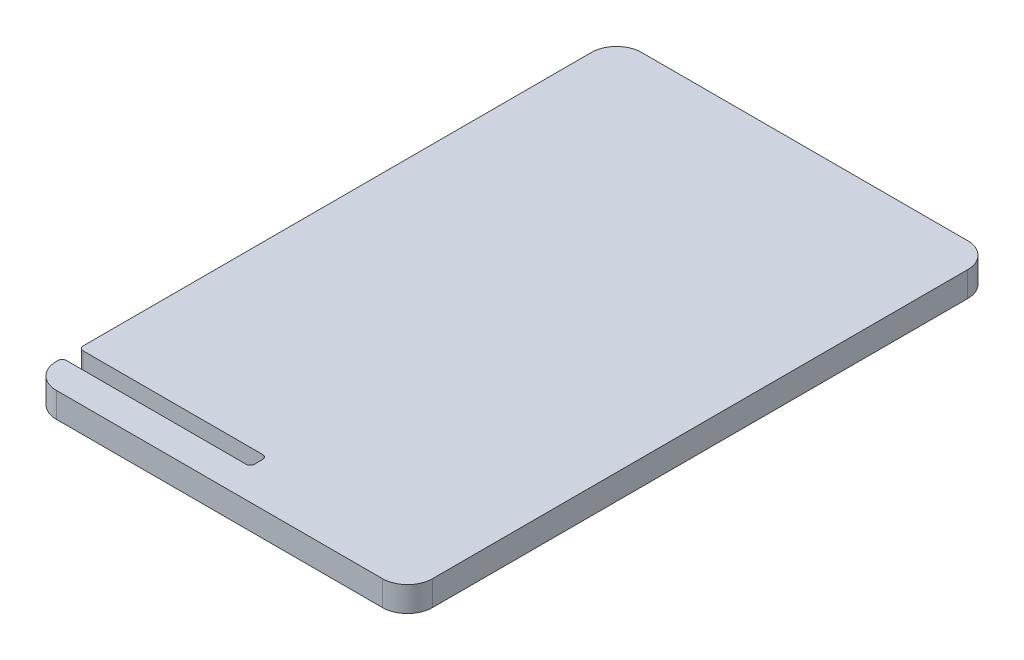
ISO-10303-21;
HEADER;
FILE_DESCRIPTION(('STEP AP214'),'2;1');
FILE_NAME('part.step','',(''),(''),'','','');
FILE_SCHEMA(('AUTOMOTIVE_DESIGN { 1 0 10303 214 1 1 1 1 }'));
ENDSEC;
DATA;
#1=APPLICATION_CONTEXT('core data for automotive mechanical design processes');
#2=APPLICATION_PROTOCOL_DEFINITION('international standard','automotive_design',2000,#1);
#3=PRODUCT_CONTEXT('',#1,'mechanical');
#4=PRODUCT('Part','Part','',(#3));
#5=PRODUCT_RELATED_PRODUCT_CATEGORY('part','',(#4));
#6=PRODUCT_DEFINITION_FORMATION('','',#4);
#7=PRODUCT_DEFINITION_CONTEXT('part definition',#1,'design');
#8=PRODUCT_DEFINITION('design','',#6,#7);
#9=PRODUCT_DEFINITION_SHAPE('','',#8);
#10=(LENGTH_UNIT() NAMED_UNIT(*) SI_UNIT(.MILLI.,.METRE.));
#11=(NAMED_UNIT(*) PLANE_ANGLE_UNIT() SI_UNIT($,.RADIAN.));
#12=(NAMED_UNIT(*) SI_UNIT($,.STERADIAN.) SOLID_ANGLE_UNIT());
#13=UNCERTAINTY_MEASURE_WITH_UNIT(LENGTH_MEASURE(1.E-05),#10,'distance_accuracy_value','');
#14=(GEOMETRIC_REPRESENTATION_CONTEXT(3) GLOBAL_UNCERTAINTY_ASSIGNED_CONTEXT((#13)) GLOBAL_UNIT_ASSIGNED_CONTEXT((#10,
#11,#12)) REPRESENTATION_CONTEXT('',''));
#15=CARTESIAN_POINT('',(0.,0.,0.));
#16=DIRECTION('',(0.,0.,1.));
#17=DIRECTION('',(1.,0.,0.));
#18=AXIS2_PLACEMENT_3D('',#15,#16,#17);
#19=CARTESIAN_POINT('',(-22.5,3.,-35.3062315740794));
#20=DIRECTION('',(1.,0.,0.));
#21=DIRECTION('',(0.,0.,-1.));
#22=AXIS2_PLACEMENT_3D('',#19,#20,#21);
#23=PLANE('',#22);
#24=DIRECTION('',(0.,0.,1.));
#25=VECTOR('',#24,1.);
#26=CARTESIAN_POINT('',(-22.5,0.,-35.3062315740794));
#27=LINE('',#26,#25);
#28=CARTESIAN_POINT('',(-22.5,0.,-32.3062315740794));
#29=VERTEX_POINT('',#28);
#30=CARTESIAN_POINT('',(-22.5,0.,28.5));
#31=VERTEX_POINT('',#30);
#32=EDGE_CURVE('E186',#29,#31,#27,.T.);
#33=ORIENTED_EDGE('',*,*,#32,.T.);
#34=DIRECTION('',(0.,1.,0.));
#35=VECTOR('',#34,1.);
#36=CARTESIAN_POINT('',(-22.5,3.,28.5));
#37=LINE('',#36,#35);
#38=CARTESIAN_POINT('',(-22.5,3.,28.5));
#39=VERTEX_POINT('',#38);
#40=EDGE_CURVE('E278',#31,#39,#37,.T.);
#41=ORIENTED_EDGE('',*,*,#40,.T.);
#42=DIRECTION('',(0.,0.,1.));
#43=VECTOR('',#42,1.);
#44=CARTESIAN_POINT('',(-22.5,3.,-35.3062315740794));
#45=LINE('',#44,#43);
#46=CARTESIAN_POINT('',(-22.5,3.,-32.3062315740794));
#47=VERTEX_POINT('',#46);
#48=EDGE_CURVE('E327',#47,#39,#45,.T.);
#49=ORIENTED_EDGE('',*,*,#48,.F.);
#50=DIRECTION('',(0.,-1.,0.));
#51=VECTOR('',#50,1.);
#52=CARTESIAN_POINT('',(-22.5,3.,-32.3062315740794));
#53=LINE('',#52,#51);
#54=EDGE_CURVE('E232',#47,#29,#53,.T.);
#55=ORIENTED_EDGE('',*,*,#54,.T.);
#56=EDGE_LOOP('',(#33,#41,#49,#55));
#57=FACE_BOUND('',#56,.T.);
#58=ADVANCED_FACE('F43',(#57),#23,.F.);
#59=CARTESIAN_POINT('',(-22.5,3.,31.5));
#60=VERTEX_POINT('',#59);
#61=CARTESIAN_POINT('',(-22.5,3.,31.6937684259206));
#62=VERTEX_POINT('',#61);
#63=EDGE_CURVE('E200',#60,#62,#45,.T.);
#64=ORIENTED_EDGE('',*,*,#63,.F.);
#65=DIRECTION('',(0.,1.,0.));
#66=VECTOR('',#65,1.);
#67=CARTESIAN_POINT('',(-22.5,3.,31.5));
#68=LINE('',#67,#66);
#69=CARTESIAN_POINT('',(-22.5,0.,31.5));
#70=VERTEX_POINT('',#69);
#71=EDGE_CURVE('E256',#60,#70,#68,.F.);
#72=ORIENTED_EDGE('',*,*,#71,.T.);
#73=CARTESIAN_POINT('',(-22.5,0.,31.6937684259206));
#74=VERTEX_POINT('',#73);
#75=EDGE_CURVE('E193',#70,#74,#27,.T.);
#76=ORIENTED_EDGE('',*,*,#75,.T.);
#77=DIRECTION('',(0.,-1.,0.));
#78=VECTOR('',#77,1.);
#79=CARTESIAN_POINT('',(-22.5,3.,31.6937684259206));
#80=LINE('',#79,#78);
#81=EDGE_CURVE('E164',#74,#62,#80,.F.);
#82=ORIENTED_EDGE('',*,*,#81,.T.);
#83=EDGE_LOOP('',(#64,#72,#76,#82));
#84=FACE_BOUND('',#83,.T.);
#85=ADVANCED_FACE('F366',(#84),#23,.F.);
#86=CARTESIAN_POINT('',(-22.5,3.,34.6937684259206));
#87=DIRECTION('',(0.,0.,-1.));
#88=DIRECTION('',(-1.,0.,0.));
#89=AXIS2_PLACEMENT_3D('',#86,#87,#88);
#90=PLANE('',#89);
#91=DIRECTION('',(1.,0.,0.));
#92=VECTOR('',#91,1.);
#93=CARTESIAN_POINT('',(-22.5,3.,34.6937684259206));
#94=LINE('',#93,#92);
#95=CARTESIAN_POINT('',(-19.5,3.,34.6937684259206));
#96=VERTEX_POINT('',#95);
#97=CARTESIAN_POINT('',(19.5,3.,34.6937684259206));
#98=VERTEX_POINT('',#97);
#99=EDGE_CURVE('E177',#96,#98,#94,.T.);
#100=ORIENTED_EDGE('',*,*,#99,.F.);
#101=DIRECTION('',(0.,-1.,0.));
#102=VECTOR('',#101,1.);
#103=CARTESIAN_POINT('',(-19.5,3.,34.6937684259206));
#104=LINE('',#103,#102);
#105=CARTESIAN_POINT('',(-19.5,0.,34.6937684259206));
#106=VERTEX_POINT('',#105);
#107=EDGE_CURVE('E162',#96,#106,#104,.T.);
#108=ORIENTED_EDGE('',*,*,#107,.T.);
#109=DIRECTION('',(1.,0.,0.));
#110=VECTOR('',#109,1.);
#111=CARTESIAN_POINT('',(-22.5,0.,34.6937684259206));
#112=LINE('',#111,#110);
#113=CARTESIAN_POINT('',(19.5,0.,34.6937684259206));
#114=VERTEX_POINT('',#113);
#115=EDGE_CURVE('E174',#106,#114,#112,.T.);
#116=ORIENTED_EDGE('',*,*,#115,.T.);
#117=DIRECTION('',(0.,-1.,0.));
#118=VECTOR('',#117,1.);
#119=CARTESIAN_POINT('',(19.5,3.,34.6937684259206));
#120=LINE('',#119,#118);
#121=EDGE_CURVE('E180',#114,#98,#120,.F.);
#122=ORIENTED_EDGE('',*,*,#121,.T.);
#123=EDGE_LOOP('',(#100,#108,#116,#122));
#124=FACE_BOUND('',#123,.T.);
#125=ADVANCED_FACE('F173',(#124),#90,.F.);
#126=CARTESIAN_POINT('',(22.5,3.,-35.3062315740794));
#127=DIRECTION('',(-1.,0.,0.));
#128=DIRECTION('',(0.,0.,1.));
#129=AXIS2_PLACEMENT_3D('',#126,#127,#128);
#130=PLANE('',#129);
#131=DIRECTION('',(0.,0.,-1.));
#132=VECTOR('',#131,1.);
#133=CARTESIAN_POINT('',(22.5,3.,-35.3062315740794));
#134=LINE('',#133,#132);
#135=CARTESIAN_POINT('',(22.5,3.,31.6937684259206));
#136=VERTEX_POINT('',#135);
#137=CARTESIAN_POINT('',(22.5,3.,-32.3062315740794));
#138=VERTEX_POINT('',#137);
#139=EDGE_CURVE('E333',#136,#138,#134,.T.);
#140=ORIENTED_EDGE('',*,*,#139,.F.);
#141=DIRECTION('',(0.,-1.,0.));
#142=VECTOR('',#141,1.);
#143=CARTESIAN_POINT('',(22.5,3.,31.6937684259206));
#144=LINE('',#143,#142);
#145=CARTESIAN_POINT('',(22.5,0.,31.6937684259206));
#146=VERTEX_POINT('',#145);
#147=EDGE_CURVE('E228',#136,#146,#144,.T.);
#148=ORIENTED_EDGE('',*,*,#147,.T.);
#149=DIRECTION('',(0.,0.,-1.));
#150=VECTOR('',#149,1.);
#151=CARTESIAN_POINT('',(22.5,0.,-35.3062315740794));
#152=LINE('',#151,#150);
#153=CARTESIAN_POINT('',(22.5,0.,-32.3062315740794));
#154=VERTEX_POINT('',#153);
#155=EDGE_CURVE('E185',#146,#154,#152,.T.);
#156=ORIENTED_EDGE('',*,*,#155,.T.);
#157=DIRECTION('',(0.,-1.,0.));
#158=VECTOR('',#157,1.);
#159=CARTESIAN_POINT('',(22.5,3.,-32.3062315740794));
#160=LINE('',#159,#158);
#161=EDGE_CURVE('E225',#154,#138,#160,.F.);
#162=ORIENTED_EDGE('',*,*,#161,.T.);
#163=EDGE_LOOP('',(#140,#148,#156,#162));
#164=FACE_BOUND('',#163,.T.);
#165=ADVANCED_FACE('F357',(#164),#130,.F.);
#166=CARTESIAN_POINT('',(-22.5,3.,-35.3062315740794));
#167=DIRECTION('',(0.,0.,1.));
#168=DIRECTION('',(1.,0.,0.));
#169=AXIS2_PLACEMENT_3D('',#166,#167,#168);
#170=PLANE('',#169);
#171=DIRECTION('',(-1.,0.,0.));
#172=VECTOR('',#171,1.);
#173=CARTESIAN_POINT('',(-22.5,0.,-35.3062315740794));
#174=LINE('',#173,#172);
#175=CARTESIAN_POINT('',(19.5,0.,-35.3062315740794));
#176=VERTEX_POINT('',#175);
#177=CARTESIAN_POINT('',(-19.5,0.,-35.3062315740794));
#178=VERTEX_POINT('',#177);
#179=EDGE_CURVE('E191',#176,#178,#174,.T.);
#180=ORIENTED_EDGE('',*,*,#179,.T.);
#181=DIRECTION('',(0.,-1.,0.));
#182=VECTOR('',#181,1.);
#183=CARTESIAN_POINT('',(-19.5,3.,-35.3062315740794));
#184=LINE('',#183,#182);
#185=CARTESIAN_POINT('',(-19.5,3.,-35.3062315740794));
#186=VERTEX_POINT('',#185);
#187=EDGE_CURVE('E240',#178,#186,#184,.F.);
#188=ORIENTED_EDGE('',*,*,#187,.T.);
#189=DIRECTION('',(-1.,0.,0.));
#190=VECTOR('',#189,1.);
#191=CARTESIAN_POINT('',(-22.5,3.,-35.3062315740794));
#192=LINE('',#191,#190);
#193=CARTESIAN_POINT('',(19.5,3.,-35.3062315740794));
#194=VERTEX_POINT('',#193);
#195=EDGE_CURVE('E202',#194,#186,#192,.T.);
#196=ORIENTED_EDGE('',*,*,#195,.F.);
#197=DIRECTION('',(0.,-1.,0.));
#198=VECTOR('',#197,1.);
#199=CARTESIAN_POINT('',(19.5,3.,-35.3062315740794));
#200=LINE('',#199,#198);
#201=EDGE_CURVE('E236',#194,#176,#200,.T.);
#202=ORIENTED_EDGE('',*,*,#201,.T.);
#203=EDGE_LOOP('',(#180,#188,#196,#202));
#204=FACE_BOUND('',#203,.T.);
#205=ADVANCED_FACE('F351',(#204),#170,.F.);
#206=CARTESIAN_POINT('',(0.,3.,0.));
#207=DIRECTION('',(0.,1.,0.));
#208=DIRECTION('',(0.,0.,1.));
#209=AXIS2_PLACEMENT_3D('',#206,#207,#208);
#210=PLANE('',#209);
#211=DIRECTION('',(1.,0.,0.));
#212=VECTOR('',#211,1.);
#213=CARTESIAN_POINT('',(-22.5,3.,31.));
#214=LINE('',#213,#212);
#215=CARTESIAN_POINT('',(-22.,3.,31.));
#216=VERTEX_POINT('',#215);
#217=CARTESIAN_POINT('',(-0.500000000000007,3.,31.));
#218=VERTEX_POINT('',#217);
#219=EDGE_CURVE('E305',#216,#218,#214,.T.);
#220=ORIENTED_EDGE('',*,*,#219,.F.);
#221=CARTESIAN_POINT('',(-22.,3.,31.5));
#222=DIRECTION('',(0.,1.,0.));
#223=DIRECTION('',(0.,0.,1.));
#224=AXIS2_PLACEMENT_3D('',#221,#222,#223);
#225=CIRCLE('',#224,0.5);
#226=EDGE_CURVE('E253',#216,#60,#225,.T.);
#227=ORIENTED_EDGE('',*,*,#226,.T.);
#228=ORIENTED_EDGE('',*,*,#63,.T.);
#229=CARTESIAN_POINT('',(-19.5,3.,31.6937684259206));
#230=DIRECTION('',(0.,1.,0.));
#231=DIRECTION('',(0.,0.,1.));
#232=AXIS2_PLACEMENT_3D('',#229,#230,#231);
#233=CIRCLE('',#232,3.);
#234=EDGE_CURVE('E222',#62,#96,#233,.T.);
#235=ORIENTED_EDGE('',*,*,#234,.T.);
#236=ORIENTED_EDGE('',*,*,#99,.T.);
#237=CARTESIAN_POINT('',(19.5,3.,31.6937684259206));
#238=DIRECTION('',(0.,1.,0.));
#239=DIRECTION('',(0.,0.,1.));
#240=AXIS2_PLACEMENT_3D('',#237,#238,#239);
#241=CIRCLE('',#240,3.);
#242=EDGE_CURVE('E219',#98,#136,#241,.T.);
#243=ORIENTED_EDGE('',*,*,#242,.T.);
#244=ORIENTED_EDGE('',*,*,#139,.T.);
#245=CARTESIAN_POINT('',(19.5,3.,-32.3062315740794));
#246=DIRECTION('',(0.,1.,0.));
#247=DIRECTION('',(0.,0.,1.));
#248=AXIS2_PLACEMENT_3D('',#245,#246,#247);
#249=CIRCLE('',#248,3.);
#250=EDGE_CURVE('E213',#138,#194,#249,.T.);
#251=ORIENTED_EDGE('',*,*,#250,.T.);
#252=ORIENTED_EDGE('',*,*,#195,.T.);
#253=CARTESIAN_POINT('',(-19.5,3.,-32.3062315740794));
#254=DIRECTION('',(0.,1.,0.));
#255=DIRECTION('',(0.,0.,1.));
#256=AXIS2_PLACEMENT_3D('',#253,#254,#255);
#257=CIRCLE('',#256,3.);
#258=EDGE_CURVE('E216',#186,#47,#257,.T.);
#259=ORIENTED_EDGE('',*,*,#258,.T.);
#260=ORIENTED_EDGE('',*,*,#48,.T.);
#261=CARTESIAN_POINT('',(-22.,3.,28.5));
#262=DIRECTION('',(0.,1.,0.));
#263=DIRECTION('',(0.,0.,1.));
#264=AXIS2_PLACEMENT_3D('',#261,#262,#263);
#265=CIRCLE('',#264,0.5);
#266=CARTESIAN_POINT('',(-22.,3.,29.));
#267=VERTEX_POINT('',#266);
#268=EDGE_CURVE('E250',#39,#267,#265,.T.);
#269=ORIENTED_EDGE('',*,*,#268,.T.);
#270=DIRECTION('',(-1.,0.,0.));
#271=VECTOR('',#270,1.);
#272=CARTESIAN_POINT('',(-22.5,3.,29.));
#273=LINE('',#272,#271);
#274=CARTESIAN_POINT('',(-0.500000000000007,3.,29.));
#275=VERTEX_POINT('',#274);
#276=EDGE_CURVE('E296',#275,#267,#273,.T.);
#277=ORIENTED_EDGE('',*,*,#276,.F.);
#278=CARTESIAN_POINT('',(-0.5,3.,29.5));
#279=DIRECTION('',(0.,1.,0.));
#280=DIRECTION('',(0.,0.,1.));
#281=AXIS2_PLACEMENT_3D('',#278,#279,#280);
#282=CIRCLE('',#281,0.5);
#283=CARTESIAN_POINT('',(0.,3.,29.5));
#284=VERTEX_POINT('',#283);
#285=EDGE_CURVE('E52',#275,#284,#282,.F.);
#286=ORIENTED_EDGE('',*,*,#285,.T.);
#287=DIRECTION('',(0.,0.,-1.));
#288=VECTOR('',#287,1.);
#289=CARTESIAN_POINT('',(0.,3.,29.));
#290=LINE('',#289,#288);
#291=CARTESIAN_POINT('',(0.,3.,30.5));
#292=VERTEX_POINT('',#291);
#293=EDGE_CURVE('E294',#292,#284,#290,.T.);
#294=ORIENTED_EDGE('',*,*,#293,.F.);
#295=CARTESIAN_POINT('',(-0.5,3.,30.5));
#296=DIRECTION('',(0.,1.,0.));
#297=DIRECTION('',(0.,0.,1.));
#298=AXIS2_PLACEMENT_3D('',#295,#296,#297);
#299=CIRCLE('',#298,0.5);
#300=EDGE_CURVE('E282',#292,#218,#299,.F.);
#301=ORIENTED_EDGE('',*,*,#300,.T.);
#302=EDGE_LOOP('',(#220,#227,#228,#235,#236,#243,#244,#251,#252,#259,#260,#269,#277,#286,#294,#301));
#303=FACE_BOUND('',#302,.T.);
#304=ADVANCED_FACE('F293',(#303),#210,.T.);
#305=CARTESIAN_POINT('',(0.,0.,0.));
#306=DIRECTION('',(0.,1.,0.));
#307=DIRECTION('',(0.,0.,1.));
#308=AXIS2_PLACEMENT_3D('',#305,#306,#307);
#309=PLANE('',#308);
#310=ORIENTED_EDGE('',*,*,#75,.F.);
#311=CARTESIAN_POINT('',(-22.,0.,31.5));
#312=DIRECTION('',(0.,1.,0.));
#313=DIRECTION('',(0.,0.,1.));
#314=AXIS2_PLACEMENT_3D('',#311,#312,#313);
#315=CIRCLE('',#314,0.5);
#316=CARTESIAN_POINT('',(-22.,0.,31.));
#317=VERTEX_POINT('',#316);
#318=EDGE_CURVE('E261',#70,#317,#315,.F.);
#319=ORIENTED_EDGE('',*,*,#318,.T.);
#320=DIRECTION('',(-1.,0.,0.));
#321=VECTOR('',#320,1.);
#322=CARTESIAN_POINT('',(-22.5,0.,31.));
#323=LINE('',#322,#321);
#324=CARTESIAN_POINT('',(-0.5,0.,31.));
#325=VERTEX_POINT('',#324);
#326=EDGE_CURVE('E313',#325,#317,#323,.T.);
#327=ORIENTED_EDGE('',*,*,#326,.F.);
#328=CARTESIAN_POINT('',(-0.5,0.,30.5));
#329=DIRECTION('',(0.,1.,0.));
#330=DIRECTION('',(0.,0.,1.));
#331=AXIS2_PLACEMENT_3D('',#328,#329,#330);
#332=CIRCLE('',#331,0.5);
#333=CARTESIAN_POINT('',(0.,0.,30.5));
#334=VERTEX_POINT('',#333);
#335=EDGE_CURVE('E285',#325,#334,#332,.T.);
#336=ORIENTED_EDGE('',*,*,#335,.T.);
#337=DIRECTION('',(0.,0.,1.));
#338=VECTOR('',#337,1.);
#339=CARTESIAN_POINT('',(0.,0.,29.));
#340=LINE('',#339,#338);
#341=CARTESIAN_POINT('',(0.,0.,29.5));
#342=VERTEX_POINT('',#341);
#343=EDGE_CURVE('E314',#342,#334,#340,.T.);
#344=ORIENTED_EDGE('',*,*,#343,.F.);
#345=CARTESIAN_POINT('',(-0.5,0.,29.5));
#346=DIRECTION('',(0.,1.,0.));
#347=DIRECTION('',(0.,0.,1.));
#348=AXIS2_PLACEMENT_3D('',#345,#346,#347);
#349=CIRCLE('',#348,0.5);
#350=CARTESIAN_POINT('',(-0.5,0.,29.));
#351=VERTEX_POINT('',#350);
#352=EDGE_CURVE('E11',#342,#351,#349,.T.);
#353=ORIENTED_EDGE('',*,*,#352,.T.);
#354=DIRECTION('',(1.,0.,0.));
#355=VECTOR('',#354,1.);
#356=CARTESIAN_POINT('',(-22.5,0.,29.));
#357=LINE('',#356,#355);
#358=CARTESIAN_POINT('',(-22.,0.,29.));
#359=VERTEX_POINT('',#358);
#360=EDGE_CURVE('E311',#359,#351,#357,.T.);
#361=ORIENTED_EDGE('',*,*,#360,.F.);
#362=CARTESIAN_POINT('',(-22.,0.,28.5));
#363=DIRECTION('',(0.,1.,0.));
#364=DIRECTION('',(0.,0.,1.));
#365=AXIS2_PLACEMENT_3D('',#362,#363,#364);
#366=CIRCLE('',#365,0.5);
#367=EDGE_CURVE('E59',#359,#31,#366,.F.);
#368=ORIENTED_EDGE('',*,*,#367,.T.);
#369=ORIENTED_EDGE('',*,*,#32,.F.);
#370=CARTESIAN_POINT('',(-19.5,0.,-32.3062315740794));
#371=DIRECTION('',(0.,1.,0.));
#372=DIRECTION('',(0.,0.,1.));
#373=AXIS2_PLACEMENT_3D('',#370,#371,#372);
#374=CIRCLE('',#373,3.);
#375=EDGE_CURVE('E206',#29,#178,#374,.F.);
#376=ORIENTED_EDGE('',*,*,#375,.T.);
#377=ORIENTED_EDGE('',*,*,#179,.F.);
#378=CARTESIAN_POINT('',(19.5,0.,-32.3062315740794));
#379=DIRECTION('',(0.,1.,0.));
#380=DIRECTION('',(0.,0.,1.));
#381=AXIS2_PLACEMENT_3D('',#378,#379,#380);
#382=CIRCLE('',#381,3.);
#383=EDGE_CURVE('E179',#176,#154,#382,.F.);
#384=ORIENTED_EDGE('',*,*,#383,.T.);
#385=ORIENTED_EDGE('',*,*,#155,.F.);
#386=CARTESIAN_POINT('',(19.5,0.,31.6937684259206));
#387=DIRECTION('',(0.,1.,0.));
#388=DIRECTION('',(0.,0.,1.));
#389=AXIS2_PLACEMENT_3D('',#386,#387,#388);
#390=CIRCLE('',#389,3.);
#391=EDGE_CURVE('E168',#146,#114,#390,.F.);
#392=ORIENTED_EDGE('',*,*,#391,.T.);
#393=ORIENTED_EDGE('',*,*,#115,.F.);
#394=CARTESIAN_POINT('',(-19.5,0.,31.6937684259206));
#395=DIRECTION('',(0.,1.,0.));
#396=DIRECTION('',(0.,0.,1.));
#397=AXIS2_PLACEMENT_3D('',#394,#395,#396);
#398=CIRCLE('',#397,3.);
#399=EDGE_CURVE('E158',#106,#74,#398,.F.);
#400=ORIENTED_EDGE('',*,*,#399,.T.);
#401=EDGE_LOOP('',(#310,#319,#327,#336,#344,#353,#361,#368,#369,#376,#377,#384,#385,#392,#393,#400));
#402=FACE_BOUND('',#401,.T.);
#403=ADVANCED_FACE('F182',(#402),#309,.F.);
#404=CARTESIAN_POINT('',(-22.5,-22.588713996153,29.));
#405=DIRECTION('',(0.,0.,-1.));
#406=DIRECTION('',(-1.,0.,0.));
#407=AXIS2_PLACEMENT_3D('',#404,#405,#406);
#408=PLANE('',#407);
#409=ORIENTED_EDGE('',*,*,#360,.T.);
#410=DIRECTION('',(0.,1.,0.));
#411=VECTOR('',#410,1.);
#412=CARTESIAN_POINT('',(-0.5,3.,29.));
#413=LINE('',#412,#411);
#414=EDGE_CURVE('E274',#351,#275,#413,.T.);
#415=ORIENTED_EDGE('',*,*,#414,.T.);
#416=ORIENTED_EDGE('',*,*,#276,.T.);
#417=DIRECTION('',(0.,1.,0.));
#418=VECTOR('',#417,1.);
#419=CARTESIAN_POINT('',(-22.,-22.588713996153,29.));
#420=LINE('',#419,#418);
#421=EDGE_CURVE('E271',#267,#359,#420,.F.);
#422=ORIENTED_EDGE('',*,*,#421,.T.);
#423=EDGE_LOOP('',(#409,#415,#416,#422));
#424=FACE_BOUND('',#423,.T.);
#425=ADVANCED_FACE('F309',(#424),#408,.F.);
#426=CARTESIAN_POINT('',(0.,-22.588713996153,29.));
#427=DIRECTION('',(1.,0.,0.));
#428=DIRECTION('',(0.,0.,-1.));
#429=AXIS2_PLACEMENT_3D('',#426,#427,#428);
#430=PLANE('',#429);
#431=ORIENTED_EDGE('',*,*,#343,.T.);
#432=DIRECTION('',(0.,1.,0.));
#433=VECTOR('',#432,1.);
#434=CARTESIAN_POINT('',(0.,3.,30.5));
#435=LINE('',#434,#433);
#436=EDGE_CURVE('E267',#334,#292,#435,.T.);
#437=ORIENTED_EDGE('',*,*,#436,.T.);
#438=ORIENTED_EDGE('',*,*,#293,.T.);
#439=DIRECTION('',(0.,1.,0.));
#440=VECTOR('',#439,1.);
#441=CARTESIAN_POINT('',(0.,0.,29.5));
#442=LINE('',#441,#440);
#443=EDGE_CURVE('E264',#284,#342,#442,.F.);
#444=ORIENTED_EDGE('',*,*,#443,.T.);
#445=EDGE_LOOP('',(#431,#437,#438,#444));
#446=FACE_BOUND('',#445,.T.);
#447=ADVANCED_FACE('F302',(#446),#430,.F.);
#448=CARTESIAN_POINT('',(-22.5,-22.588713996153,31.));
#449=DIRECTION('',(0.,0.,1.));
#450=DIRECTION('',(1.,0.,0.));
#451=AXIS2_PLACEMENT_3D('',#448,#449,#450);
#452=PLANE('',#451);
#453=ORIENTED_EDGE('',*,*,#326,.T.);
#454=DIRECTION('',(0.,1.,0.));
#455=VECTOR('',#454,1.);
#456=CARTESIAN_POINT('',(-22.,-22.588713996153,31.));
#457=LINE('',#456,#455);
#458=EDGE_CURVE('E246',#317,#216,#457,.T.);
#459=ORIENTED_EDGE('',*,*,#458,.T.);
#460=ORIENTED_EDGE('',*,*,#219,.T.);
#461=DIRECTION('',(0.,1.,0.));
#462=VECTOR('',#461,1.);
#463=CARTESIAN_POINT('',(-0.5,0.,31.));
#464=LINE('',#463,#462);
#465=EDGE_CURVE('E243',#218,#325,#464,.F.);
#466=ORIENTED_EDGE('',*,*,#465,.T.);
#467=EDGE_LOOP('',(#453,#459,#460,#466));
#468=FACE_BOUND('',#467,.T.);
#469=ADVANCED_FACE('F374',(#468),#452,.F.);
#470=CARTESIAN_POINT('',(-19.5,3.,31.6937684259206));
#471=DIRECTION('',(0.,-1.,0.));
#472=DIRECTION('',(0.,0.,-1.));
#473=AXIS2_PLACEMENT_3D('',#470,#471,#472);
#474=CYLINDRICAL_SURFACE('',#473,3.);
#475=ORIENTED_EDGE('',*,*,#234,.F.);
#476=ORIENTED_EDGE('',*,*,#81,.F.);
#477=ORIENTED_EDGE('',*,*,#399,.F.);
#478=ORIENTED_EDGE('',*,*,#107,.F.);
#479=EDGE_LOOP('',(#475,#476,#477,#478));
#480=FACE_BOUND('',#479,.T.);
#481=ADVANCED_FACE('F161',(#480),#474,.T.);
#482=CARTESIAN_POINT('',(19.5,3.,31.6937684259206));
#483=DIRECTION('',(0.,-1.,0.));
#484=DIRECTION('',(0.,0.,-1.));
#485=AXIS2_PLACEMENT_3D('',#482,#483,#484);
#486=CYLINDRICAL_SURFACE('',#485,3.);
#487=ORIENTED_EDGE('',*,*,#242,.F.);
#488=ORIENTED_EDGE('',*,*,#121,.F.);
#489=ORIENTED_EDGE('',*,*,#391,.F.);
#490=ORIENTED_EDGE('',*,*,#147,.F.);
#491=EDGE_LOOP('',(#487,#488,#489,#490));
#492=FACE_BOUND('',#491,.T.);
#493=ADVANCED_FACE('F361',(#492),#486,.T.);
#494=CARTESIAN_POINT('',(-19.5,3.,-32.3062315740794));
#495=DIRECTION('',(0.,-1.,0.));
#496=DIRECTION('',(0.,0.,-1.));
#497=AXIS2_PLACEMENT_3D('',#494,#495,#496);
#498=CYLINDRICAL_SURFACE('',#497,3.);
#499=ORIENTED_EDGE('',*,*,#258,.F.);
#500=ORIENTED_EDGE('',*,*,#187,.F.);
#501=ORIENTED_EDGE('',*,*,#375,.F.);
#502=ORIENTED_EDGE('',*,*,#54,.F.);
#503=EDGE_LOOP('',(#499,#500,#501,#502));
#504=FACE_BOUND('',#503,.T.);
#505=ADVANCED_FACE('F347',(#504),#498,.T.);
#506=CARTESIAN_POINT('',(19.5,3.,-32.3062315740794));
#507=DIRECTION('',(0.,-1.,0.));
#508=DIRECTION('',(0.,0.,-1.));
#509=AXIS2_PLACEMENT_3D('',#506,#507,#508);
#510=CYLINDRICAL_SURFACE('',#509,3.);
#511=ORIENTED_EDGE('',*,*,#250,.F.);
#512=ORIENTED_EDGE('',*,*,#161,.F.);
#513=ORIENTED_EDGE('',*,*,#383,.F.);
#514=ORIENTED_EDGE('',*,*,#201,.F.);
#515=EDGE_LOOP('',(#511,#512,#513,#514));
#516=FACE_BOUND('',#515,.T.);
#517=ADVANCED_FACE('F353',(#516),#510,.T.);
#518=CARTESIAN_POINT('',(-22.,-22.588713996153,31.5));
#519=DIRECTION('',(0.,1.,0.));
#520=DIRECTION('',(0.,0.,1.));
#521=AXIS2_PLACEMENT_3D('',#518,#519,#520);
#522=CYLINDRICAL_SURFACE('',#521,0.5);
#523=ORIENTED_EDGE('',*,*,#318,.F.);
#524=ORIENTED_EDGE('',*,*,#71,.F.);
#525=ORIENTED_EDGE('',*,*,#226,.F.);
#526=ORIENTED_EDGE('',*,*,#458,.F.);
#527=EDGE_LOOP('',(#523,#524,#525,#526));
#528=FACE_BOUND('',#527,.T.);
#529=ADVANCED_FACE('F372',(#528),#522,.T.);
#530=CARTESIAN_POINT('',(-0.5,-22.588713996153,30.5));
#531=DIRECTION('',(0.,-1.,0.));
#532=DIRECTION('',(0.,0.,-1.));
#533=AXIS2_PLACEMENT_3D('',#530,#531,#532);
#534=CYLINDRICAL_SURFACE('',#533,0.5);
#535=ORIENTED_EDGE('',*,*,#335,.F.);
#536=ORIENTED_EDGE('',*,*,#465,.F.);
#537=ORIENTED_EDGE('',*,*,#300,.F.);
#538=ORIENTED_EDGE('',*,*,#436,.F.);
#539=EDGE_LOOP('',(#535,#536,#537,#538));
#540=FACE_BOUND('',#539,.T.);
#541=ADVANCED_FACE('F378',(#540),#534,.F.);
#542=CARTESIAN_POINT('',(-0.5,-22.588713996153,29.5));
#543=DIRECTION('',(0.,-1.,0.));
#544=DIRECTION('',(0.,0.,-1.));
#545=AXIS2_PLACEMENT_3D('',#542,#543,#544);
#546=CYLINDRICAL_SURFACE('',#545,0.5);
#547=ORIENTED_EDGE('',*,*,#352,.F.);
#548=ORIENTED_EDGE('',*,*,#443,.F.);
#549=ORIENTED_EDGE('',*,*,#285,.F.);
#550=ORIENTED_EDGE('',*,*,#414,.F.);
#551=EDGE_LOOP('',(#547,#548,#549,#550));
#552=FACE_BOUND('',#551,.T.);
#553=ADVANCED_FACE('F307',(#552),#546,.F.);
#554=CARTESIAN_POINT('',(-22.,3.,28.5));
#555=DIRECTION('',(0.,1.,0.));
#556=DIRECTION('',(0.,0.,1.));
#557=AXIS2_PLACEMENT_3D('',#554,#555,#556);
#558=CYLINDRICAL_SURFACE('',#557,0.5);
#559=ORIENTED_EDGE('',*,*,#367,.F.);
#560=ORIENTED_EDGE('',*,*,#421,.F.);
#561=ORIENTED_EDGE('',*,*,#268,.F.);
#562=ORIENTED_EDGE('',*,*,#40,.F.);
#563=EDGE_LOOP('',(#559,#560,#561,#562));
#564=FACE_BOUND('',#563,.T.);
#565=ADVANCED_FACE('F45',(#564),#558,.T.);
#566=CLOSED_SHELL('',(#58,#85,#125,#165,#205,#304,#403,#425,#447,#469,#481,#493,#505,#517,#529,
#541,#553,#565));
#567=MANIFOLD_SOLID_BREP('B2',#566);
#568=ADVANCED_BREP_SHAPE_REPRESENTATION('',(#18,#567),#14);
#569=SHAPE_DEFINITION_REPRESENTATION(#9,#568);
ENDSEC;
END-ISO-10303-21;
